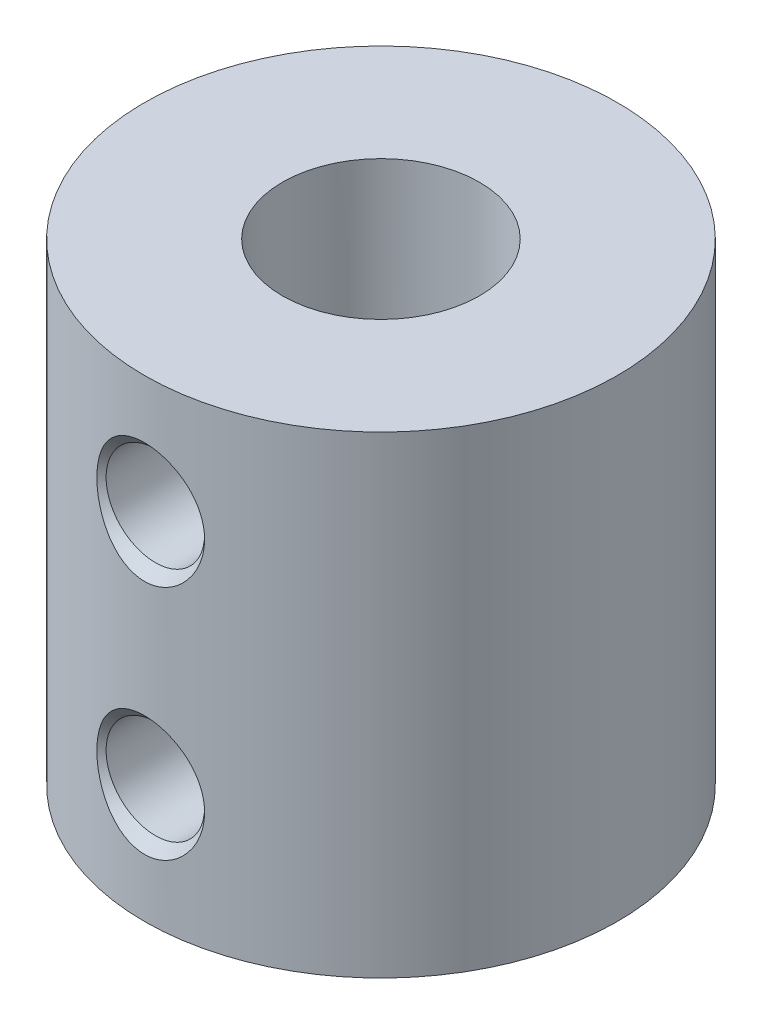
ISO-10303-21;
HEADER;
FILE_DESCRIPTION(('STEP AP214'),'2;1');
FILE_NAME('part.step','',(''),(''),'','','');
FILE_SCHEMA(('AUTOMOTIVE_DESIGN { 1 0 10303 214 1 1 1 1 }'));
ENDSEC;
DATA;
#1=APPLICATION_CONTEXT('core data for automotive mechanical design processes');
#2=APPLICATION_PROTOCOL_DEFINITION('international standard','automotive_design',2000,#1);
#3=PRODUCT_CONTEXT('',#1,'mechanical');
#4=PRODUCT('Part','Part','',(#3));
#5=PRODUCT_RELATED_PRODUCT_CATEGORY('part','',(#4));
#6=PRODUCT_DEFINITION_FORMATION('','',#4);
#7=PRODUCT_DEFINITION_CONTEXT('part definition',#1,'design');
#8=PRODUCT_DEFINITION('design','',#6,#7);
#9=PRODUCT_DEFINITION_SHAPE('','',#8);
#10=(LENGTH_UNIT() NAMED_UNIT(*) SI_UNIT(.MILLI.,.METRE.));
#11=(NAMED_UNIT(*) PLANE_ANGLE_UNIT() SI_UNIT($,.RADIAN.));
#12=(NAMED_UNIT(*) SI_UNIT($,.STERADIAN.) SOLID_ANGLE_UNIT());
#13=UNCERTAINTY_MEASURE_WITH_UNIT(LENGTH_MEASURE(1.E-05),#10,'distance_accuracy_value','');
#14=(GEOMETRIC_REPRESENTATION_CONTEXT(3) GLOBAL_UNCERTAINTY_ASSIGNED_CONTEXT((#13)) GLOBAL_UNIT_ASSIGNED_CONTEXT((#10,
#11,#12)) REPRESENTATION_CONTEXT('',''));
#15=CARTESIAN_POINT('',(0.,0.,0.));
#16=DIRECTION('',(0.,0.,1.));
#17=DIRECTION('',(1.,0.,0.));
#18=AXIS2_PLACEMENT_3D('',#15,#16,#17);
#19=CARTESIAN_POINT('',(-1.45322348865449,13.6450243442956,2.4942884406893));
#20=DIRECTION('',(0.00394361579578582,0.,-0.999992223916994));
#21=DIRECTION('',(-0.999992223916994,0.,-0.00394361579578582));
#22=AXIS2_PLACEMENT_3D('',#19,#20,#21);
#23=PLANE('',#22);
#24=CARTESIAN_POINT('',(-0.00601415438862823,3.,2.49999572266002));
#25=DIRECTION('',(0.00394361579578582,0.,-0.999992223916994));
#26=DIRECTION('',(-0.999992223916994,0.,-0.00394361579578582));
#27=AXIS2_PLACEMENT_3D('',#24,#25,#26);
#28=ELLIPSE('',#27,1.52503557650191,1.52501185880323);
#29=CARTESIAN_POINT('',(1.43350540967556,2.49653518295812,2.50567267889569));
#30=VERTEX_POINT('',#29);
#31=CARTESIAN_POINT('',(0.,1.475,2.50001944035869));
#32=VERTEX_POINT('',#31);
#33=EDGE_CURVE('E56',#30,#32,#28,.T.);
#34=ORIENTED_EDGE('',*,*,#33,.F.);
#35=DIRECTION('',(0.,-1.,0.));
#36=VECTOR('',#35,1.);
#37=CARTESIAN_POINT('',(1.43350540967556,13.6450243442956,2.50567267889569));
#38=LINE('',#37,#36);
#39=CARTESIAN_POINT('',(1.43350540967556,0.,2.50567267889569));
#40=VERTEX_POINT('',#39);
#41=EDGE_CURVE('E237',#30,#40,#38,.T.);
#42=ORIENTED_EDGE('',*,*,#41,.T.);
#43=DIRECTION('',(0.999992223916994,0.,0.00394361579578582));
#44=VECTOR('',#43,1.);
#45=CARTESIAN_POINT('',(-1.45322348865449,0.,2.4942884406893));
#46=LINE('',#45,#44);
#47=CARTESIAN_POINT('',(-1.45322348865449,0.,2.4942884406893));
#48=VERTEX_POINT('',#47);
#49=EDGE_CURVE('E265',#48,#40,#46,.T.);
#50=ORIENTED_EDGE('',*,*,#49,.F.);
#51=DIRECTION('',(0.,-1.,0.));
#52=VECTOR('',#51,1.);
#53=CARTESIAN_POINT('',(-1.45322348865449,13.6450243442956,2.4942884406893));
#54=LINE('',#53,#52);
#55=CARTESIAN_POINT('',(-1.45322348865449,2.53765111439211,2.4942884406893));
#56=VERTEX_POINT('',#55);
#57=EDGE_CURVE('E253',#56,#48,#54,.T.);
#58=ORIENTED_EDGE('',*,*,#57,.F.);
#59=CARTESIAN_POINT('',(0.,3.,2.50001944035869));
#60=DIRECTION('',(0.00394361579578582,0.,-0.999992223916994));
#61=DIRECTION('',(0.999992223916994,0.,0.00394361579578582));
#62=AXIS2_PLACEMENT_3D('',#59,#60,#61);
#63=ELLIPSE('',#62,1.5250118586188,1.525);
#64=EDGE_CURVE('E211',#32,#56,#63,.T.);
#65=ORIENTED_EDGE('',*,*,#64,.F.);
#66=EDGE_LOOP('',(#34,#42,#50,#58,#65));
#67=FACE_BOUND('',#66,.T.);
#68=ADVANCED_FACE('F31',(#67),#23,.T.);
#69=CARTESIAN_POINT('',(0.,0.,0.));
#70=DIRECTION('',(0.,1.,0.));
#71=DIRECTION('',(0.,0.,1.));
#72=AXIS2_PLACEMENT_3D('',#69,#70,#71);
#73=PLANE('',#72);
#74=CARTESIAN_POINT('',(0.,0.,0.));
#75=DIRECTION('',(0.,1.,0.));
#76=DIRECTION('',(0.,0.,1.));
#77=AXIS2_PLACEMENT_3D('',#74,#75,#76);
#78=CIRCLE('',#77,6.);
#79=CARTESIAN_POINT('',(0.,0.,6.));
#80=VERTEX_POINT('',#79);
#81=EDGE_CURVE('E221',#80,#80,#78,.T.);
#82=ORIENTED_EDGE('',*,*,#81,.F.);
#83=EDGE_LOOP('',(#82));
#84=FACE_BOUND('',#83,.T.);
#85=DIRECTION('',(0.496580840496581,0.,0.867990477396906));
#86=VECTOR('',#85,1.);
#87=CARTESIAN_POINT('',(-2.88672889833005,0.,-0.0113842382063857));
#88=LINE('',#87,#86);
#89=CARTESIAN_POINT('',(-2.88672889833005,0.,-0.0113842382063857));
#90=VERTEX_POINT('',#89);
#91=EDGE_CURVE('E254',#90,#48,#88,.T.);
#92=ORIENTED_EDGE('',*,*,#91,.T.);
#93=ORIENTED_EDGE('',*,*,#49,.T.);
#94=DIRECTION('',(0.503411383420413,0.,-0.864046861601121));
#95=VECTOR('',#94,1.);
#96=CARTESIAN_POINT('',(1.43350540967556,0.,2.50567267889569));
#97=LINE('',#96,#95);
#98=CARTESIAN_POINT('',(2.88672889833005,0.,0.0113842382063875));
#99=VERTEX_POINT('',#98);
#100=EDGE_CURVE('E263',#40,#99,#97,.T.);
#101=ORIENTED_EDGE('',*,*,#100,.T.);
#102=DIRECTION('',(-0.496580840496581,0.,-0.867990477396906));
#103=VECTOR('',#102,1.);
#104=CARTESIAN_POINT('',(2.88672889833005,0.,0.0113842382063875));
#105=LINE('',#104,#103);
#106=CARTESIAN_POINT('',(1.45322348865449,0.,-2.4942884406893));
#107=VERTEX_POINT('',#106);
#108=EDGE_CURVE('E261',#99,#107,#105,.T.);
#109=ORIENTED_EDGE('',*,*,#108,.T.);
#110=DIRECTION('',(-0.999992223916994,0.,-0.00394361579578567));
#111=VECTOR('',#110,1.);
#112=CARTESIAN_POINT('',(1.45322348865449,0.,-2.4942884406893));
#113=LINE('',#112,#111);
#114=CARTESIAN_POINT('',(-1.43350540967556,0.,-2.50567267889569));
#115=VERTEX_POINT('',#114);
#116=EDGE_CURVE('E259',#107,#115,#113,.T.);
#117=ORIENTED_EDGE('',*,*,#116,.T.);
#118=DIRECTION('',(-0.503411383420413,0.,0.864046861601121));
#119=VECTOR('',#118,1.);
#120=CARTESIAN_POINT('',(-1.43350540967556,0.,-2.50567267889569));
#121=LINE('',#120,#119);
#122=EDGE_CURVE('E257',#115,#90,#121,.T.);
#123=ORIENTED_EDGE('',*,*,#122,.T.);
#124=EDGE_LOOP('',(#92,#93,#101,#109,#117,#123));
#125=FACE_BOUND('',#124,.T.);
#126=ADVANCED_FACE('F159',(#84,#125),#73,.F.);
#127=CARTESIAN_POINT('',(0.,12.,0.));
#128=DIRECTION('',(0.,-1.,0.));
#129=DIRECTION('',(0.,0.,-1.));
#130=AXIS2_PLACEMENT_3D('',#127,#128,#129);
#131=CYLINDRICAL_SURFACE('',#130,2.5);
#132=CARTESIAN_POINT('',(1.525,9.,1.98100353356575));
#133=CARTESIAN_POINT('',(1.52499492171974,8.92374722139207,1.98101129789833));
#134=CARTESIAN_POINT('',(1.51922907839568,8.84735606596177,1.98548718326427));
#135=CARTESIAN_POINT('',(1.49655848145347,8.69709416937525,2.00262330984394));
#136=CARTESIAN_POINT('',(1.47962031728919,8.62323168924482,2.01530809742034));
#137=CARTESIAN_POINT('',(1.43576786079199,8.4806588850031,2.04677412274575));
#138=CARTESIAN_POINT('',(1.40893650458591,8.41191128243371,2.06550452101057));
#139=CARTESIAN_POINT('',(1.34630316554546,8.27997772868786,2.10686343501451));
#140=CARTESIAN_POINT('',(1.31050175711183,8.21679142174165,2.1294917011232));
#141=CARTESIAN_POINT('',(1.22563990373981,8.0889331097008,2.17957074598538));
#142=CARTESIAN_POINT('',(1.17547282184875,8.02509218338219,2.20726897245733));
#143=CARTESIAN_POINT('',(1.0655658868299,7.90603239419761,2.2623781635907));
#144=CARTESIAN_POINT('',(1.00581801705445,7.85082082895542,2.28978886702423));
#145=CARTESIAN_POINT('',(0.870272534013958,7.7444198082331,2.34490030781887));
#146=CARTESIAN_POINT('',(0.793424484679834,7.6943881393866,2.37228442298518));
#147=CARTESIAN_POINT('',(0.63041341873413,7.60835665055166,2.4206985385051));
#148=CARTESIAN_POINT('',(0.544259351699337,7.57234349979293,2.44173457120396));
#149=CARTESIAN_POINT('',(0.373989830773632,7.51915122360809,2.47323212045012));
#150=CARTESIAN_POINT('',(0.29050096036796,7.50047307209759,2.48452745034391));
#151=CARTESIAN_POINT('',(0.120891942139537,7.47739921438317,2.49851940159797));
#152=CARTESIAN_POINT('',(0.03477446719025,7.47298945777558,2.501224481918));
#153=CARTESIAN_POINT('',(-0.125743840141964,7.47834833402955,2.49795938630501));
#154=CARTESIAN_POINT('',(-0.200233078496372,7.48637390817483,2.49305561328968));
#155=CARTESIAN_POINT('',(-0.346571351754475,7.51304199617311,2.47695494154555));
#156=CARTESIAN_POINT('',(-0.418420186896576,7.53168531156582,2.46575756770986));
#157=CARTESIAN_POINT('',(-0.558032645396032,7.57884414329162,2.43796958987444));
#158=CARTESIAN_POINT('',(-0.625776094438257,7.60740439510174,2.4213545678248));
#159=CARTESIAN_POINT('',(-0.755580439312915,7.67333943281927,2.38404386833898));
#160=CARTESIAN_POINT('',(-0.817639928925312,7.71071639185926,2.36334718506582));
#161=CARTESIAN_POINT('',(-0.942401898319157,7.79833410143713,2.31664325426361));
#162=CARTESIAN_POINT('',(-1.00426612603097,7.84958609686116,2.2902962981657));
#163=CARTESIAN_POINT('',(-1.11905100774202,7.96088784147643,2.23646019911834));
#164=CARTESIAN_POINT('',(-1.17195894296089,8.02094987970214,2.20896949978178));
#165=CARTESIAN_POINT('',(-1.27385380489807,8.15679988897633,2.15199865351112));
#166=CARTESIAN_POINT('',(-1.32157939831417,8.23361216885946,2.12268370171008));
#167=CARTESIAN_POINT('',(-1.40321363223876,8.39598531252457,2.06963104069322));
#168=CARTESIAN_POINT('',(-1.43714783370176,8.48152962062531,2.04588304858662));
#169=CARTESIAN_POINT('',(-1.48271437882387,8.63673507367936,2.01299230746254));
#170=CARTESIAN_POINT('',(-1.49782183190419,8.70491299981811,2.0016720844378));
#171=CARTESIAN_POINT('',(-1.51855394609946,8.84344865115027,1.98599354182264));
#172=CARTESIAN_POINT('',(-1.52419038273947,8.91380355859098,1.98162657744618));
#173=CARTESIAN_POINT('',(-1.52564799438549,9.0547975496988,1.9805049039136));
#174=CARTESIAN_POINT('',(-1.52145226801517,9.12543691402157,1.98376330265693));
#175=CARTESIAN_POINT('',(-1.5034804604902,9.26479634992738,1.99741516325187));
#176=CARTESIAN_POINT('',(-1.4896966368959,9.33351482370082,2.00781439127396));
#177=CARTESIAN_POINT('',(-1.45340740666528,9.46688428552705,2.03423196145524));
#178=CARTESIAN_POINT('',(-1.43096348486023,9.53156029453818,2.05021061652279));
#179=CARTESIAN_POINT('',(-1.37816622519893,9.65641709437996,2.08606672890409));
#180=CARTESIAN_POINT('',(-1.34780998317732,9.71659622420323,2.10594561710906));
#181=CARTESIAN_POINT('',(-1.27359440731444,9.84253552608357,2.15178755744497));
#182=CARTESIAN_POINT('',(-1.22827681179747,9.90727489525008,2.17819630532248));
#183=CARTESIAN_POINT('',(-1.12834104438345,10.0289204185559,2.23160553827569));
#184=CARTESIAN_POINT('',(-1.07371362916918,10.085818685065,2.25860658798106));
#185=CARTESIAN_POINT('',(-0.947494256102589,10.1983315727948,2.31466361812934));
#186=CARTESIAN_POINT('',(-0.874595272646756,10.2526217561897,2.34346860181092));
#187=CARTESIAN_POINT('',(-0.718901983115557,10.3480063439564,2.39581051166219));
#188=CARTESIAN_POINT('',(-0.636113611752499,10.3891086084673,2.41935057323699));
#189=CARTESIAN_POINT('',(-0.468672987092277,10.4537750340264,2.45707063477177));
#190=CARTESIAN_POINT('',(-0.384532519388757,10.4783437545921,2.47177931356308));
#191=CARTESIAN_POINT('',(-0.212279035718037,10.5126955340819,2.49247451209789));
#192=CARTESIAN_POINT('',(-0.124171039271207,10.5224967633025,2.49847175029215));
#193=CARTESIAN_POINT('',(0.0401910320853542,10.5263709017881,2.50083738946254));
#194=CARTESIAN_POINT('',(0.116388777882105,10.5224424143792,2.49842938930696));
#195=CARTESIAN_POINT('',(0.266836533639424,10.5033861268299,2.48686281486913));
#196=CARTESIAN_POINT('',(0.341086560344629,10.4882584230024,2.47770429864111));
#197=CARTESIAN_POINT('',(0.483936965853625,10.4480383696321,2.45375984543673));
#198=CARTESIAN_POINT('',(0.552628256592004,10.4231843988741,2.43910885884555));
#199=CARTESIAN_POINT('',(0.684849461574841,10.3644936490671,2.40533630023946));
#200=CARTESIAN_POINT('',(0.748378359727262,10.3306551071888,2.38621385098351));
#201=CARTESIAN_POINT('',(0.875820971152278,10.250921023234,2.34263624333162));
#202=CARTESIAN_POINT('',(0.939047795302068,10.2041225365883,2.31782935025686));
#203=CARTESIAN_POINT('',(1.05723366080752,10.1018176983202,2.2663674570174));
#204=CARTESIAN_POINT('',(1.11218298662153,10.0463012678383,2.23971033795266));
#205=CARTESIAN_POINT('',(1.21984942582394,9.91946461961594,2.18314865852935));
#206=CARTESIAN_POINT('',(1.27127714427543,9.8470233531553,2.15328842601601));
#207=CARTESIAN_POINT('',(1.36129177654849,9.69313277745862,2.09754453551839));
#208=CARTESIAN_POINT('',(1.39988816924632,9.61169017730123,2.07165794972857));
#209=CARTESIAN_POINT('',(1.45555819839569,9.46037936940661,2.03279034740367));
#210=CARTESIAN_POINT('',(1.47551186037458,9.39197904562177,2.01821876267025));
#211=CARTESIAN_POINT('',(1.50570389400192,9.25211165437958,1.99580073738226));
#212=CARTESIAN_POINT('',(1.51597432734032,9.18065553231768,1.9879321113816));
#213=CARTESIAN_POINT('',(1.52241220729945,9.09064890592793,1.9829929818964));
#214=CARTESIAN_POINT('',(1.52338141760783,9.07254424412859,1.98224872168731));
#215=CARTESIAN_POINT('',(1.52467597564328,9.03629567293081,1.98125302956268));
#216=CARTESIAN_POINT('',(1.52500120887018,9.01815175712696,1.98100168528846));
#217=CARTESIAN_POINT('',(1.525,9.,1.98100353356575));
#218=B_SPLINE_CURVE_WITH_KNOTS('',3,(#132,#133,#134,#135,#136,#137,#138,#139,#140,#141,#142,
#143,#144,#145,#146,#147,#148,#149,#150,#151,#152,#153,#154,#155,#156,#157,#158,#159,#160,#161,
#162,#163,#164,#165,#166,#167,#168,#169,#170,#171,#172,#173,#174,#175,#176,#177,#178,#179,#180,
#181,#182,#183,#184,#185,#186,#187,#188,#189,#190,#191,#192,#193,#194,#195,#196,#197,#198,#199,
#200,#201,#202,#203,#204,#205,#206,#207,#208,#209,#210,#211,#212,#213,#214,#215,#216,#217),
.UNSPECIFIED.,.T.,.F.,(4,2,2,2,2,2,2,2,2,2,2,2,2,2,2,2,2,2,2,2,2,2,2,2,2,2,2,2,2,2,2,2,2,2,2,2,
2,2,2,2,2,2,4),(0.,0.228674727302821,0.45803642006556,0.685517504561196,0.912984025939703,
1.16934864128595,1.4259288978906,1.71147615038918,1.99675119731817,2.25408958921758,
2.511174497074,2.7353431922148,2.95952881222954,3.18473916578186,3.41000508705098,
3.66264452589884,3.91563978041089,4.19943258312745,4.48269697914798,4.69402695598139,
4.90509398661276,5.11652410514946,5.32812515313112,5.53825073013599,5.74845354123268,
5.99746395344112,6.2467230531981,6.53130347395548,6.81571396534028,7.08073630439865,
7.34543228617464,7.57330017737474,7.80116610894088,8.0237657054468,8.24640900970454,
8.49288731243608,8.73965269682945,9.01953711215542,9.29921430683183,9.51653575674796,
9.7331350902332,9.7875607827372,9.84199615134741),.UNSPECIFIED.);
#219=CARTESIAN_POINT('',(0.,7.475,2.5));
#220=VERTEX_POINT('',#219);
#221=CARTESIAN_POINT('',(0.,10.525,2.5));
#222=VERTEX_POINT('',#221);
#223=EDGE_CURVE('E42',#220,#222,#218,.T.);
#224=ORIENTED_EDGE('',*,*,#223,.F.);
#225=EDGE_CURVE('E132',#222,#220,#218,.T.);
#226=ORIENTED_EDGE('',*,*,#225,.F.);
#227=EDGE_LOOP('',(#224,#226));
#228=FACE_BOUND('',#227,.T.);
#229=CARTESIAN_POINT('',(0.,12.,0.));
#230=DIRECTION('',(0.,1.,0.));
#231=DIRECTION('',(0.,0.,1.));
#232=AXIS2_PLACEMENT_3D('',#229,#230,#231);
#233=CIRCLE('',#232,2.5);
#234=CARTESIAN_POINT('',(0.,12.,2.5));
#235=VERTEX_POINT('',#234);
#236=EDGE_CURVE('E224',#235,#235,#233,.T.);
#237=ORIENTED_EDGE('',*,*,#236,.T.);
#238=EDGE_LOOP('',(#237));
#239=FACE_BOUND('',#238,.T.);
#240=CARTESIAN_POINT('',(0.,6.,0.));
#241=DIRECTION('',(0.,-1.,0.));
#242=DIRECTION('',(0.,0.,-1.));
#243=AXIS2_PLACEMENT_3D('',#240,#241,#242);
#244=CIRCLE('',#243,2.5);
#245=CARTESIAN_POINT('',(-2.16011715400281,6.,-1.25852845855104));
#246=VERTEX_POINT('',#245);
#247=CARTESIAN_POINT('',(0.00985903948946421,6.,-2.49998055979249));
#248=VERTEX_POINT('',#247);
#249=EDGE_CURVE('E216',#246,#248,#244,.T.);
#250=ORIENTED_EDGE('',*,*,#249,.T.);
#251=CARTESIAN_POINT('',(2.16997619349227,6.,-1.24145210124146));
#252=VERTEX_POINT('',#251);
#253=EDGE_CURVE('E214',#248,#252,#244,.T.);
#254=ORIENTED_EDGE('',*,*,#253,.T.);
#255=CARTESIAN_POINT('',(2.16011715400281,6.,1.25852845855104));
#256=VERTEX_POINT('',#255);
#257=EDGE_CURVE('E369',#252,#256,#244,.T.);
#258=ORIENTED_EDGE('',*,*,#257,.T.);
#259=CARTESIAN_POINT('',(-0.00985903948946457,6.,2.49998055979249));
#260=VERTEX_POINT('',#259);
#261=EDGE_CURVE('E371',#256,#260,#244,.T.);
#262=ORIENTED_EDGE('',*,*,#261,.T.);
#263=CARTESIAN_POINT('',(-2.16997619349227,6.,1.24145210124146));
#264=VERTEX_POINT('',#263);
#265=EDGE_CURVE('E372',#260,#264,#244,.T.);
#266=ORIENTED_EDGE('',*,*,#265,.T.);
#267=EDGE_CURVE('E219',#264,#246,#244,.T.);
#268=ORIENTED_EDGE('',*,*,#267,.T.);
#269=EDGE_LOOP('',(#250,#254,#258,#262,#266,#268));
#270=FACE_BOUND('',#269,.T.);
#271=ADVANCED_FACE('F142',(#228,#239,#270),#131,.F.);
#272=CARTESIAN_POINT('',(0.,12.,0.));
#273=DIRECTION('',(0.,1.,0.));
#274=DIRECTION('',(0.,0.,1.));
#275=AXIS2_PLACEMENT_3D('',#272,#273,#274);
#276=PLANE('',#275);
#277=CARTESIAN_POINT('',(0.,12.,0.));
#278=DIRECTION('',(0.,1.,0.));
#279=DIRECTION('',(0.,0.,1.));
#280=AXIS2_PLACEMENT_3D('',#277,#278,#279);
#281=CIRCLE('',#280,6.);
#282=CARTESIAN_POINT('',(0.,12.,6.));
#283=VERTEX_POINT('',#282);
#284=EDGE_CURVE('E220',#283,#283,#281,.T.);
#285=ORIENTED_EDGE('',*,*,#284,.T.);
#286=EDGE_LOOP('',(#285));
#287=FACE_BOUND('',#286,.T.);
#288=ORIENTED_EDGE('',*,*,#236,.F.);
#289=EDGE_LOOP('',(#288));
#290=FACE_BOUND('',#289,.T.);
#291=ADVANCED_FACE('F158',(#287,#290),#276,.T.);
#292=CARTESIAN_POINT('',(0.,12.,0.));
#293=DIRECTION('',(0.,-1.,0.));
#294=DIRECTION('',(0.,0.,-1.));
#295=AXIS2_PLACEMENT_3D('',#292,#293,#294);
#296=CYLINDRICAL_SURFACE('',#295,6.);
#297=CARTESIAN_POINT('',(-1.00732038769462,7.97119565281463,5.91483775658699));
#298=CARTESIAN_POINT('',(-1.0625572167337,8.03844908000393,5.90543128244687));
#299=CARTESIAN_POINT('',(-1.1119450928033,8.11062669730159,5.89622727626031));
#300=CARTESIAN_POINT('',(-1.19816011091402,8.26237990598063,5.87931576917396));
#301=CARTESIAN_POINT('',(-1.23496409543614,8.34196879728746,5.87161103842038));
#302=CARTESIAN_POINT('',(-1.29550008714942,8.50648277213711,5.85855311445987));
#303=CARTESIAN_POINT('',(-1.31918435597302,8.591426106717,5.8532085231466));
#304=CARTESIAN_POINT('',(-1.35290234778387,8.76406516825956,5.84550733148309));
#305=CARTESIAN_POINT('',(-1.36294121055757,8.8517598461385,5.8431496060991));
#306=CARTESIAN_POINT('',(-1.3693652007367,9.03146998880358,5.84164829843658));
#307=CARTESIAN_POINT('',(-1.36514396828115,9.12350894726367,5.84264744553621));
#308=CARTESIAN_POINT('',(-1.34176422645992,9.30559136720378,5.84806031937853));
#309=CARTESIAN_POINT('',(-1.32260179220375,9.39563429795639,5.85247494332733));
#310=CARTESIAN_POINT('',(-1.26955658372633,9.57145553867203,5.86421037888129));
#311=CARTESIAN_POINT('',(-1.23561954165774,9.65721681488935,5.87154189574134));
#312=CARTESIAN_POINT('',(-1.15355452356077,9.82148962855673,5.88821351349967));
#313=CARTESIAN_POINT('',(-1.10542559254557,9.90000067766452,5.89755374955527));
#314=CARTESIAN_POINT('',(-0.997431067079704,10.0448106928749,5.91675947634123));
#315=CARTESIAN_POINT('',(-0.937956064421903,10.1114028757775,5.92660116071936));
#316=CARTESIAN_POINT('',(-0.807572778572499,10.2323901106385,5.9457671407107));
#317=CARTESIAN_POINT('',(-0.736672119814302,10.286793238982,5.9550917758162));
#318=CARTESIAN_POINT('',(-0.592229184508391,10.3762518231714,5.97110086326186));
#319=CARTESIAN_POINT('',(-0.519522334296951,10.4126221867845,5.97794883133935));
#320=CARTESIAN_POINT('',(-0.368354061775824,10.4708855125874,5.98915923947937));
#321=CARTESIAN_POINT('',(-0.289899115696944,10.4927944976266,5.99352442965381));
#322=CARTESIAN_POINT('',(-0.13979016106698,10.5190323166964,5.99878383296519));
#323=CARTESIAN_POINT('',(-0.0684608162744464,10.5251664888293,6.00003390907518));
#324=CARTESIAN_POINT('',(0.0741565668801915,10.5248268419741,5.99996473941875));
#325=CARTESIAN_POINT('',(0.145444611044835,10.5183573019057,5.99864636563278));
#326=CARTESIAN_POINT('',(0.281699711330631,10.4939071631755,5.99374965828111));
#327=CARTESIAN_POINT('',(0.346795376060321,10.4766042077672,5.99030452290538));
#328=CARTESIAN_POINT('',(0.473295716776515,10.4319346045143,5.98163978874799));
#329=CARTESIAN_POINT('',(0.534699911497291,10.4045666477676,5.97641995918308));
#330=CARTESIAN_POINT('',(0.655148937892169,10.3394349372709,5.96444546834219));
#331=CARTESIAN_POINT('',(0.713964814463624,10.3012603652792,5.95763252098112));
#332=CARTESIAN_POINT('',(0.82507501536845,10.216506750001,5.94326477324329));
#333=CARTESIAN_POINT('',(0.8773667917489,10.1699244403857,5.93570968507338));
#334=CARTESIAN_POINT('',(0.979878874616082,10.0643720246854,5.91969696852427));
#335=CARTESIAN_POINT('',(1.02928222856886,10.0046103660667,5.91122908464167));
#336=CARTESIAN_POINT('',(1.11849706997978,9.87823014899506,5.89499995296438));
#337=CARTESIAN_POINT('',(1.15830421538346,9.81160850594788,5.88723902603517));
#338=CARTESIAN_POINT('',(1.23150221770142,9.66585454340792,5.87238854278172));
#339=CARTESIAN_POINT('',(1.26377583596079,9.58614357888775,5.86545576964514));
#340=CARTESIAN_POINT('',(1.31553900889379,9.42250533559973,5.85406362893617));
#341=CARTESIAN_POINT('',(1.33502492532302,9.33857686420947,5.84960496533133));
#342=CARTESIAN_POINT('',(1.36167438773833,9.1636712904829,5.84346196331302));
#343=CARTESIAN_POINT('',(1.36805648423666,9.07256792484541,5.84195380587374));
#344=CARTESIAN_POINT('',(1.36606722652635,8.89052541720313,5.84241898623785));
#345=CARTESIAN_POINT('',(1.35769381176682,8.79958629991025,5.84439281028674));
#346=CARTESIAN_POINT('',(1.3261106711044,8.61912748245144,5.8516404284706));
#347=CARTESIAN_POINT('',(1.30269440448541,8.52964560690141,5.85696014054536));
#348=CARTESIAN_POINT('',(1.24121316011803,8.35604499571632,5.87029590269997));
#349=CARTESIAN_POINT('',(1.20314612768998,8.27192701426407,5.87831233095778));
#350=CARTESIAN_POINT('',(1.1136494956924,8.11291762780887,5.895916249366));
#351=CARTESIAN_POINT('',(1.06242403970803,8.03790900811002,5.90547897651683));
#352=CARTESIAN_POINT('',(0.94722814343741,7.89842517093241,5.92504502332219));
#353=CARTESIAN_POINT('',(0.883261528037212,7.83394680282687,5.93504821005079));
#354=CARTESIAN_POINT('',(0.748703574776038,7.72237185830967,5.95346362496181));
#355=CARTESIAN_POINT('',(0.678855355228888,7.67439323956131,5.96193773582487));
#356=CARTESIAN_POINT('',(0.531105524715199,7.5926261830056,5.9769062092819));
#357=CARTESIAN_POINT('',(0.453213174667967,7.55882164912783,5.98340281521654));
#358=CARTESIAN_POINT('',(0.301742486861647,7.51061122445053,5.99282925286203));
#359=CARTESIAN_POINT('',(0.228770506103551,7.49436240978149,5.99609387934914));
#360=CARTESIAN_POINT('',(0.0810310347313773,7.47543284426644,5.99990641356615));
#361=CARTESIAN_POINT('',(0.00626477786796735,7.47274302440823,6.00045613716958));
#362=CARTESIAN_POINT('',(-0.135775253712959,7.48069860234123,5.99884670170859));
#363=CARTESIAN_POINT('',(-0.203121027444959,7.49017273925062,5.99692544307746));
#364=CARTESIAN_POINT('',(-0.335264748290144,7.51999831924415,5.99099100463259));
#365=CARTESIAN_POINT('',(-0.400062186390656,7.54035192369985,5.98697740914826));
#366=CARTESIAN_POINT('',(-0.526115404644997,7.59126421541546,5.97722735475829));
#367=CARTESIAN_POINT('',(-0.587328336188919,7.62192484104546,5.97147374623539));
#368=CARTESIAN_POINT('',(-0.704205646800114,7.69216775988878,5.95882130341706));
#369=CARTESIAN_POINT('',(-0.759873062239021,7.73174513170679,5.95192310140536));
#370=CARTESIAN_POINT('',(-0.847902845940636,7.80455406337528,5.93989518893234));
#371=CARTESIAN_POINT('',(-0.88200657651437,7.83573912583488,5.93490934552203));
#372=CARTESIAN_POINT('',(-0.94706242091887,7.90121935686673,5.92487592256493));
#373=CARTESIAN_POINT('',(-0.978014589884656,7.93551447101031,5.91982834409989));
#374=CARTESIAN_POINT('',(-1.00732038769462,7.97119565281463,5.91483775658699));
#375=B_SPLINE_CURVE_WITH_KNOTS('',3,(#297,#298,#299,#300,#301,#302,#303,#304,#305,#306,#307,
#308,#309,#310,#311,#312,#313,#314,#315,#316,#317,#318,#319,#320,#321,#322,#323,#324,#325,#326,
#327,#328,#329,#330,#331,#332,#333,#334,#335,#336,#337,#338,#339,#340,#341,#342,#343,#344,#345,
#346,#347,#348,#349,#350,#351,#352,#353,#354,#355,#356,#357,#358,#359,#360,#361,#362,#363,#364,
#365,#366,#367,#368,#369,#370,#371,#372,#373,#374),.UNSPECIFIED.,.T.,.F.,(4,2,2,2,2,2,2,2,2,2,2,
2,2,2,2,2,2,2,2,2,2,2,2,2,2,2,2,2,2,2,2,2,2,2,2,2,2,2,4),(0.,0.262436347529811,
0.525353076759216,0.789220293463882,1.05298809229006,1.32811039544878,1.6033049945899,
1.87951903929043,2.1557516749615,2.42378855151125,2.69164729993872,2.93499491007315,
3.17807244246412,3.39175918356619,3.60537339135055,3.80680298500644,4.00825878282087,
4.21874018382816,4.42930353161712,4.66234338592003,4.89548848808494,5.15318720780322,
5.41095921394385,5.6837032303038,5.95648533734414,6.23309524058099,6.50974395079712,
6.78233570784822,7.05484575606622,7.30888108663872,7.56262714858272,7.7858815721096,
8.00898665079045,8.21213588750413,8.41532549790893,8.62058689753883,8.82573528413765,
8.96497284079323,9.10420796113756),.UNSPECIFIED.);
#376=CARTESIAN_POINT('',(-1.00732038769462,7.97119565281463,5.91483775658699));
#377=VERTEX_POINT('',#376);
#378=EDGE_CURVE('E11',#377,#377,#375,.T.);
#379=ORIENTED_EDGE('',*,*,#378,.T.);
#380=EDGE_LOOP('',(#379));
#381=FACE_BOUND('',#380,.T.);
#382=CARTESIAN_POINT('',(-1.00732038769462,1.97119565281462,5.91483775658699));
#383=CARTESIAN_POINT('',(-1.06255721673369,2.03844908000393,5.90543128244687));
#384=CARTESIAN_POINT('',(-1.1119450928033,2.11062669730158,5.89622727626031));
#385=CARTESIAN_POINT('',(-1.19816011091402,2.26237990598063,5.87931576917396));
#386=CARTESIAN_POINT('',(-1.23496409543614,2.34196879728746,5.87161103842038));
#387=CARTESIAN_POINT('',(-1.29550008714942,2.50648277213711,5.85855311445987));
#388=CARTESIAN_POINT('',(-1.31918435597302,2.591426106717,5.8532085231466));
#389=CARTESIAN_POINT('',(-1.35290234778387,2.76406516825956,5.84550733148309));
#390=CARTESIAN_POINT('',(-1.36294121055757,2.85175984613849,5.8431496060991));
#391=CARTESIAN_POINT('',(-1.3693652007367,3.03146998880358,5.84164829843658));
#392=CARTESIAN_POINT('',(-1.36514396828115,3.12350894726367,5.84264744553621));
#393=CARTESIAN_POINT('',(-1.34176422645992,3.30559136720378,5.84806031937853));
#394=CARTESIAN_POINT('',(-1.32260179220375,3.39563429795639,5.85247494332733));
#395=CARTESIAN_POINT('',(-1.26955658372633,3.57145553867203,5.86421037888129));
#396=CARTESIAN_POINT('',(-1.23561954165774,3.65721681488935,5.87154189574134));
#397=CARTESIAN_POINT('',(-1.15355452356077,3.82148962855673,5.88821351349967));
#398=CARTESIAN_POINT('',(-1.10542559254557,3.90000067766452,5.89755374955527));
#399=CARTESIAN_POINT('',(-0.997431067079705,4.04481069287493,5.91675947634123));
#400=CARTESIAN_POINT('',(-0.937956064421904,4.11140287577748,5.92660116071936));
#401=CARTESIAN_POINT('',(-0.8075727785725,4.23239011063855,5.9457671407107));
#402=CARTESIAN_POINT('',(-0.736672119814304,4.286793238982,5.9550917758162));
#403=CARTESIAN_POINT('',(-0.592229184508393,4.37625182317138,5.97110086326186));
#404=CARTESIAN_POINT('',(-0.519522334296952,4.41262218678446,5.97794883133935));
#405=CARTESIAN_POINT('',(-0.368354061775825,4.47088551258738,5.98915923947937));
#406=CARTESIAN_POINT('',(-0.289899115696945,4.49279449762663,5.99352442965381));
#407=CARTESIAN_POINT('',(-0.139790161066981,4.51903231669636,5.99878383296519));
#408=CARTESIAN_POINT('',(-0.0684608162744478,4.52516648882927,6.00003390907518));
#409=CARTESIAN_POINT('',(0.07415656688019,4.52482684197411,5.99996473941875));
#410=CARTESIAN_POINT('',(0.145444611044833,4.5183573019057,5.99864636563278));
#411=CARTESIAN_POINT('',(0.28169971133063,4.49390716317546,5.99374965828111));
#412=CARTESIAN_POINT('',(0.34679537606032,4.4766042077672,5.99030452290538));
#413=CARTESIAN_POINT('',(0.473295716776515,4.4319346045143,5.98163978874799));
#414=CARTESIAN_POINT('',(0.53469991149729,4.40456664776762,5.97641995918308));
#415=CARTESIAN_POINT('',(0.655148937892168,4.33943493727088,5.96444546834219));
#416=CARTESIAN_POINT('',(0.713964814463623,4.3012603652792,5.95763252098112));
#417=CARTESIAN_POINT('',(0.825075015368449,4.21650675000096,5.94326477324329));
#418=CARTESIAN_POINT('',(0.877366791748898,4.16992444038573,5.93570968507338));
#419=CARTESIAN_POINT('',(0.979878874616081,4.06437202468535,5.91969696852427));
#420=CARTESIAN_POINT('',(1.02928222856886,4.00461036606669,5.91122908464167));
#421=CARTESIAN_POINT('',(1.11849706997978,3.87823014899506,5.89499995296438));
#422=CARTESIAN_POINT('',(1.15830421538346,3.81160850594788,5.88723902603517));
#423=CARTESIAN_POINT('',(1.23150221770142,3.66585454340792,5.87238854278172));
#424=CARTESIAN_POINT('',(1.26377583596079,3.58614357888775,5.86545576964514));
#425=CARTESIAN_POINT('',(1.31553900889379,3.42250533559973,5.85406362893617));
#426=CARTESIAN_POINT('',(1.33502492532302,3.33857686420947,5.84960496533133));
#427=CARTESIAN_POINT('',(1.36167438773833,3.1636712904829,5.84346196331302));
#428=CARTESIAN_POINT('',(1.36805648423666,3.07256792484541,5.84195380587374));
#429=CARTESIAN_POINT('',(1.36606722652635,2.89052541720313,5.84241898623785));
#430=CARTESIAN_POINT('',(1.35769381176682,2.79958629991025,5.84439281028674));
#431=CARTESIAN_POINT('',(1.3261106711044,2.61912748245144,5.8516404284706));
#432=CARTESIAN_POINT('',(1.30269440448541,2.52964560690141,5.85696014054536));
#433=CARTESIAN_POINT('',(1.24121316011803,2.35604499571632,5.87029590269997));
#434=CARTESIAN_POINT('',(1.20314612768998,2.27192701426407,5.87831233095778));
#435=CARTESIAN_POINT('',(1.11364949569239,2.11291762780887,5.895916249366));
#436=CARTESIAN_POINT('',(1.06242403970803,2.03790900811002,5.90547897651683));
#437=CARTESIAN_POINT('',(0.94722814343741,1.89842517093241,5.92504502332219));
#438=CARTESIAN_POINT('',(0.883261528037212,1.83394680282687,5.93504821005079));
#439=CARTESIAN_POINT('',(0.74870357477604,1.72237185830967,5.95346362496181));
#440=CARTESIAN_POINT('',(0.67885535522889,1.67439323956131,5.96193773582487));
#441=CARTESIAN_POINT('',(0.531105524715202,1.5926261830056,5.9769062092819));
#442=CARTESIAN_POINT('',(0.453213174667969,1.55882164912783,5.98340281521654));
#443=CARTESIAN_POINT('',(0.301742486861648,1.51061122445053,5.99282925286203));
#444=CARTESIAN_POINT('',(0.228770506103553,1.49436240978149,5.99609387934914));
#445=CARTESIAN_POINT('',(0.0810310347313785,1.47543284426643,5.99990641356615));
#446=CARTESIAN_POINT('',(0.00626477786796845,1.47274302440823,6.00045613716958));
#447=CARTESIAN_POINT('',(-0.135775253712958,1.48069860234123,5.99884670170859));
#448=CARTESIAN_POINT('',(-0.203121027444957,1.49017273925062,5.99692544307746));
#449=CARTESIAN_POINT('',(-0.335264748290142,1.51999831924415,5.99099100463259));
#450=CARTESIAN_POINT('',(-0.400062186390655,1.54035192369985,5.98697740914826));
#451=CARTESIAN_POINT('',(-0.526115404644996,1.59126421541545,5.97722735475829));
#452=CARTESIAN_POINT('',(-0.587328336188919,1.62192484104546,5.97147374623539));
#453=CARTESIAN_POINT('',(-0.704205646800113,1.69216775988878,5.95882130341706));
#454=CARTESIAN_POINT('',(-0.75987306223902,1.73174513170679,5.95192310140536));
#455=CARTESIAN_POINT('',(-0.847902845940636,1.80455406337528,5.93989518893234));
#456=CARTESIAN_POINT('',(-0.882006576514369,1.83573912583487,5.93490934552203));
#457=CARTESIAN_POINT('',(-0.947062420918868,1.90121935686673,5.92487592256493));
#458=CARTESIAN_POINT('',(-0.978014589884654,1.93551447101031,5.91982834409989));
#459=CARTESIAN_POINT('',(-1.00732038769462,1.97119565281462,5.91483775658699));
#460=B_SPLINE_CURVE_WITH_KNOTS('',3,(#382,#383,#384,#385,#386,#387,#388,#389,#390,#391,#392,
#393,#394,#395,#396,#397,#398,#399,#400,#401,#402,#403,#404,#405,#406,#407,#408,#409,#410,#411,
#412,#413,#414,#415,#416,#417,#418,#419,#420,#421,#422,#423,#424,#425,#426,#427,#428,#429,#430,
#431,#432,#433,#434,#435,#436,#437,#438,#439,#440,#441,#442,#443,#444,#445,#446,#447,#448,#449,
#450,#451,#452,#453,#454,#455,#456,#457,#458,#459),.UNSPECIFIED.,.T.,.F.,(4,2,2,2,2,2,2,2,2,2,2,
2,2,2,2,2,2,2,2,2,2,2,2,2,2,2,2,2,2,2,2,2,2,2,2,2,2,2,4),(0.,0.262436347529811,
0.525353076759217,0.789220293463884,1.05298809229006,1.32811039544879,1.6033049945899,
1.87951903929043,2.1557516749615,2.42378855151125,2.69164729993872,2.93499491007315,
3.17807244246412,3.39175918356619,3.60537339135056,3.80680298500644,4.00825878282087,
4.21874018382816,4.42930353161712,4.66234338592003,4.89548848808494,5.15318720780322,
5.41095921394385,5.6837032303038,5.95648533734414,6.23309524058099,6.50974395079712,
6.78233570784822,7.05484575606622,7.30888108663872,7.56262714858272,7.7858815721096,
8.00898665079045,8.21213588750413,8.41532549790892,8.62058689753882,8.82573528413764,
8.96497284079322,9.10420796113756),.UNSPECIFIED.);
#461=CARTESIAN_POINT('',(-1.00732038769462,1.97119565281462,5.91483775658699));
#462=VERTEX_POINT('',#461);
#463=EDGE_CURVE('E144',#462,#462,#460,.T.);
#464=ORIENTED_EDGE('',*,*,#463,.T.);
#465=EDGE_LOOP('',(#464));
#466=FACE_BOUND('',#465,.T.);
#467=ORIENTED_EDGE('',*,*,#284,.F.);
#468=EDGE_LOOP('',(#467));
#469=FACE_BOUND('',#468,.T.);
#470=ORIENTED_EDGE('',*,*,#81,.T.);
#471=EDGE_LOOP('',(#470));
#472=FACE_BOUND('',#471,.T.);
#473=ADVANCED_FACE('F164',(#381,#466,#469,#472),#296,.T.);
#474=CARTESIAN_POINT('',(-2.88672889833005,13.6450243442956,-0.0113842382063857));
#475=DIRECTION('',(0.867990477396906,0.,-0.496580840496581));
#476=DIRECTION('',(-0.496580840496581,0.,-0.867990477396906));
#477=AXIS2_PLACEMENT_3D('',#474,#475,#476);
#478=PLANE('',#477);
#479=DIRECTION('',(-0.496580840496581,0.,-0.867990477396906));
#480=VECTOR('',#479,1.);
#481=CARTESIAN_POINT('',(-2.88672889833005,6.,-0.0113842382063857));
#482=LINE('',#481,#480);
#483=CARTESIAN_POINT('',(-2.88672889833005,6.,-0.0113842382063857));
#484=VERTEX_POINT('',#483);
#485=EDGE_CURVE('E234',#264,#484,#482,.T.);
#486=ORIENTED_EDGE('',*,*,#485,.F.);
#487=CARTESIAN_POINT('',(-1.45322348865449,6.,2.4942884406893));
#488=VERTEX_POINT('',#487);
#489=EDGE_CURVE('E230',#488,#264,#482,.T.);
#490=ORIENTED_EDGE('',*,*,#489,.F.);
#491=CARTESIAN_POINT('',(-1.45322348865449,3.46234888560791,2.4942884406893));
#492=VERTEX_POINT('',#491);
#493=EDGE_CURVE('E250',#488,#492,#54,.T.);
#494=ORIENTED_EDGE('',*,*,#493,.T.);
#495=EDGE_CURVE('E252',#492,#56,#54,.T.);
#496=ORIENTED_EDGE('',*,*,#495,.T.);
#497=ORIENTED_EDGE('',*,*,#57,.T.);
#498=ORIENTED_EDGE('',*,*,#91,.F.);
#499=DIRECTION('',(0.,-1.,0.));
#500=VECTOR('',#499,1.);
#501=CARTESIAN_POINT('',(-2.88672889833005,13.6450243442956,-0.0113842382063857));
#502=LINE('',#501,#500);
#503=EDGE_CURVE('E247',#484,#90,#502,.T.);
#504=ORIENTED_EDGE('',*,*,#503,.F.);
#505=EDGE_LOOP('',(#486,#490,#494,#496,#497,#498,#504));
#506=FACE_BOUND('',#505,.T.);
#507=ADVANCED_FACE('F170',(#506),#478,.T.);
#508=CARTESIAN_POINT('',(-1.43350540967556,13.6450243442956,-2.50567267889569));
#509=DIRECTION('',(0.864046861601121,0.,0.503411383420413));
#510=DIRECTION('',(0.503411383420413,0.,-0.864046861601121));
#511=AXIS2_PLACEMENT_3D('',#508,#509,#510);
#512=PLANE('',#511);
#513=DIRECTION('',(0.503411383420413,0.,-0.864046861601121));
#514=VECTOR('',#513,1.);
#515=CARTESIAN_POINT('',(-1.43350540967556,6.,-2.50567267889569));
#516=LINE('',#515,#514);
#517=CARTESIAN_POINT('',(-1.43350540967556,6.,-2.50567267889569));
#518=VERTEX_POINT('',#517);
#519=EDGE_CURVE('E233',#246,#518,#516,.T.);
#520=ORIENTED_EDGE('',*,*,#519,.F.);
#521=EDGE_CURVE('E283',#484,#246,#516,.T.);
#522=ORIENTED_EDGE('',*,*,#521,.F.);
#523=ORIENTED_EDGE('',*,*,#503,.T.);
#524=ORIENTED_EDGE('',*,*,#122,.F.);
#525=DIRECTION('',(0.,-1.,0.));
#526=VECTOR('',#525,1.);
#527=CARTESIAN_POINT('',(-1.43350540967556,13.6450243442956,-2.50567267889569));
#528=LINE('',#527,#526);
#529=EDGE_CURVE('E244',#518,#115,#528,.T.);
#530=ORIENTED_EDGE('',*,*,#529,.F.);
#531=EDGE_LOOP('',(#520,#522,#523,#524,#530));
#532=FACE_BOUND('',#531,.T.);
#533=ADVANCED_FACE('F176',(#532),#512,.T.);
#534=CARTESIAN_POINT('',(1.45322348865449,13.6450243442956,-2.4942884406893));
#535=DIRECTION('',(-0.00394361579578567,0.,0.999992223916994));
#536=DIRECTION('',(0.999992223916994,0.,0.00394361579578567));
#537=AXIS2_PLACEMENT_3D('',#534,#535,#536);
#538=PLANE('',#537);
#539=DIRECTION('',(0.999992223916994,0.,0.00394361579578567));
#540=VECTOR('',#539,1.);
#541=CARTESIAN_POINT('',(1.45322348865449,6.,-2.4942884406893));
#542=LINE('',#541,#540);
#543=CARTESIAN_POINT('',(1.45322348865449,6.,-2.4942884406893));
#544=VERTEX_POINT('',#543);
#545=EDGE_CURVE('E282',#248,#544,#542,.T.);
#546=ORIENTED_EDGE('',*,*,#545,.F.);
#547=EDGE_CURVE('E280',#518,#248,#542,.T.);
#548=ORIENTED_EDGE('',*,*,#547,.F.);
#549=ORIENTED_EDGE('',*,*,#529,.T.);
#550=ORIENTED_EDGE('',*,*,#116,.F.);
#551=DIRECTION('',(0.,-1.,0.));
#552=VECTOR('',#551,1.);
#553=CARTESIAN_POINT('',(1.45322348865449,13.6450243442956,-2.4942884406893));
#554=LINE('',#553,#552);
#555=EDGE_CURVE('E241',#544,#107,#554,.T.);
#556=ORIENTED_EDGE('',*,*,#555,.F.);
#557=EDGE_LOOP('',(#546,#548,#549,#550,#556));
#558=FACE_BOUND('',#557,.T.);
#559=ADVANCED_FACE('F347',(#558),#538,.T.);
#560=CARTESIAN_POINT('',(2.88672889833005,13.6450243442956,0.0113842382063875));
#561=DIRECTION('',(-0.867990477396906,0.,0.496580840496581));
#562=DIRECTION('',(0.496580840496581,0.,0.867990477396906));
#563=AXIS2_PLACEMENT_3D('',#560,#561,#562);
#564=PLANE('',#563);
#565=DIRECTION('',(0.496580840496581,0.,0.867990477396906));
#566=VECTOR('',#565,1.);
#567=CARTESIAN_POINT('',(2.88672889833005,6.,0.0113842382063875));
#568=LINE('',#567,#566);
#569=CARTESIAN_POINT('',(2.88672889833005,6.,0.0113842382063875));
#570=VERTEX_POINT('',#569);
#571=EDGE_CURVE('E279',#252,#570,#568,.T.);
#572=ORIENTED_EDGE('',*,*,#571,.F.);
#573=EDGE_CURVE('E276',#544,#252,#568,.T.);
#574=ORIENTED_EDGE('',*,*,#573,.F.);
#575=ORIENTED_EDGE('',*,*,#555,.T.);
#576=ORIENTED_EDGE('',*,*,#108,.F.);
#577=DIRECTION('',(0.,-1.,0.));
#578=VECTOR('',#577,1.);
#579=CARTESIAN_POINT('',(2.88672889833005,13.6450243442956,0.0113842382063875));
#580=LINE('',#579,#578);
#581=EDGE_CURVE('E238',#570,#99,#580,.T.);
#582=ORIENTED_EDGE('',*,*,#581,.F.);
#583=EDGE_LOOP('',(#572,#574,#575,#576,#582));
#584=FACE_BOUND('',#583,.T.);
#585=ADVANCED_FACE('F196',(#584),#564,.T.);
#586=CARTESIAN_POINT('',(1.43350540967556,13.6450243442956,2.50567267889569));
#587=DIRECTION('',(-0.864046861601121,0.,-0.503411383420413));
#588=DIRECTION('',(-0.503411383420413,0.,0.864046861601121));
#589=AXIS2_PLACEMENT_3D('',#586,#587,#588);
#590=PLANE('',#589);
#591=DIRECTION('',(-0.503411383420413,0.,0.864046861601121));
#592=VECTOR('',#591,1.);
#593=CARTESIAN_POINT('',(1.43350540967556,6.,2.50567267889569));
#594=LINE('',#593,#592);
#595=CARTESIAN_POINT('',(1.43350540967556,6.,2.50567267889569));
#596=VERTEX_POINT('',#595);
#597=EDGE_CURVE('E275',#256,#596,#594,.T.);
#598=ORIENTED_EDGE('',*,*,#597,.F.);
#599=EDGE_CURVE('E272',#570,#256,#594,.T.);
#600=ORIENTED_EDGE('',*,*,#599,.F.);
#601=ORIENTED_EDGE('',*,*,#581,.T.);
#602=ORIENTED_EDGE('',*,*,#100,.F.);
#603=ORIENTED_EDGE('',*,*,#41,.F.);
#604=CARTESIAN_POINT('',(1.43350540967556,3.5034648170419,2.50567267889569));
#605=VERTEX_POINT('',#604);
#606=EDGE_CURVE('E236',#605,#30,#38,.T.);
#607=ORIENTED_EDGE('',*,*,#606,.F.);
#608=EDGE_CURVE('E209',#596,#605,#38,.T.);
#609=ORIENTED_EDGE('',*,*,#608,.F.);
#610=EDGE_LOOP('',(#598,#600,#601,#602,#603,#607,#609));
#611=FACE_BOUND('',#610,.T.);
#612=ADVANCED_FACE('F186',(#611),#590,.T.);
#613=CARTESIAN_POINT('',(0.,4.525,2.50001944035869));
#614=VERTEX_POINT('',#613);
#615=EDGE_CURVE('E202',#614,#605,#28,.T.);
#616=ORIENTED_EDGE('',*,*,#615,.F.);
#617=EDGE_CURVE('E205',#492,#614,#63,.T.);
#618=ORIENTED_EDGE('',*,*,#617,.F.);
#619=ORIENTED_EDGE('',*,*,#493,.F.);
#620=DIRECTION('',(-0.999992223916994,0.,-0.00394361579578582));
#621=VECTOR('',#620,1.);
#622=CARTESIAN_POINT('',(-1.45322348865449,6.,2.4942884406893));
#623=LINE('',#622,#621);
#624=EDGE_CURVE('E271',#260,#488,#623,.T.);
#625=ORIENTED_EDGE('',*,*,#624,.F.);
#626=EDGE_CURVE('E229',#596,#260,#623,.T.);
#627=ORIENTED_EDGE('',*,*,#626,.F.);
#628=ORIENTED_EDGE('',*,*,#608,.T.);
#629=EDGE_LOOP('',(#616,#618,#619,#625,#627,#628));
#630=FACE_BOUND('',#629,.T.);
#631=ADVANCED_FACE('F160',(#630),#23,.T.);
#632=CARTESIAN_POINT('',(0.,6.,0.));
#633=DIRECTION('',(0.,-1.,0.));
#634=DIRECTION('',(0.,0.,-1.));
#635=AXIS2_PLACEMENT_3D('',#632,#633,#634);
#636=PLANE('',#635);
#637=ORIENTED_EDGE('',*,*,#545,.T.);
#638=ORIENTED_EDGE('',*,*,#573,.T.);
#639=ORIENTED_EDGE('',*,*,#253,.F.);
#640=EDGE_LOOP('',(#637,#638,#639));
#641=FACE_BOUND('',#640,.T.);
#642=ADVANCED_FACE('F185',(#641),#636,.T.);
#643=ORIENTED_EDGE('',*,*,#571,.T.);
#644=ORIENTED_EDGE('',*,*,#599,.T.);
#645=ORIENTED_EDGE('',*,*,#257,.F.);
#646=EDGE_LOOP('',(#643,#644,#645));
#647=FACE_BOUND('',#646,.T.);
#648=ADVANCED_FACE('F192',(#647),#636,.T.);
#649=ORIENTED_EDGE('',*,*,#597,.T.);
#650=ORIENTED_EDGE('',*,*,#626,.T.);
#651=ORIENTED_EDGE('',*,*,#261,.F.);
#652=EDGE_LOOP('',(#649,#650,#651));
#653=FACE_BOUND('',#652,.T.);
#654=ADVANCED_FACE('F384',(#653),#636,.T.);
#655=ORIENTED_EDGE('',*,*,#624,.T.);
#656=ORIENTED_EDGE('',*,*,#489,.T.);
#657=ORIENTED_EDGE('',*,*,#265,.F.);
#658=EDGE_LOOP('',(#655,#656,#657));
#659=FACE_BOUND('',#658,.T.);
#660=ADVANCED_FACE('F381',(#659),#636,.T.);
#661=ORIENTED_EDGE('',*,*,#485,.T.);
#662=ORIENTED_EDGE('',*,*,#521,.T.);
#663=ORIENTED_EDGE('',*,*,#267,.F.);
#664=EDGE_LOOP('',(#661,#662,#663));
#665=FACE_BOUND('',#664,.T.);
#666=ADVANCED_FACE('F342',(#665),#636,.T.);
#667=ORIENTED_EDGE('',*,*,#519,.T.);
#668=ORIENTED_EDGE('',*,*,#547,.T.);
#669=ORIENTED_EDGE('',*,*,#249,.F.);
#670=EDGE_LOOP('',(#667,#668,#669));
#671=FACE_BOUND('',#670,.T.);
#672=ADVANCED_FACE('F195',(#671),#636,.T.);
#673=CARTESIAN_POINT('',(0.,3.,6.));
#674=DIRECTION('',(0.,0.,1.));
#675=DIRECTION('',(1.,0.,0.));
#676=AXIS2_PLACEMENT_3D('',#673,#674,#675);
#677=CONICAL_SURFACE('',#676,1.525,0.785398163397447);
#678=CARTESIAN_POINT('',(0.,3.,5.725));
#679=DIRECTION('',(0.,0.,1.));
#680=DIRECTION('',(1.,0.,0.));
#681=AXIS2_PLACEMENT_3D('',#678,#679,#680);
#682=CIRCLE('',#681,1.25);
#683=CARTESIAN_POINT('',(1.25,3.,5.725));
#684=VERTEX_POINT('',#683);
#685=EDGE_CURVE('E268',#684,#684,#682,.T.);
#686=ORIENTED_EDGE('',*,*,#685,.F.);
#687=EDGE_LOOP('',(#686));
#688=FACE_BOUND('',#687,.T.);
#689=ORIENTED_EDGE('',*,*,#463,.F.);
#690=EDGE_LOOP('',(#689));
#691=FACE_BOUND('',#690,.T.);
#692=ADVANCED_FACE('F330',(#688,#691),#677,.F.);
#693=CARTESIAN_POINT('',(-1.45322348865449,13.6450243442956,2.4942884406893));
#694=DIRECTION('',(0.00394361579578582,0.,-0.999992223916994));
#695=DIRECTION('',(-0.999992223916994,0.,-0.00394361579578582));
#696=AXIS2_PLACEMENT_3D('',#693,#694,#695);
#697=PLANE('',#696);
#698=CARTESIAN_POINT('',(0.,3.,2.50001944035869));
#699=DIRECTION('',(0.00394361579578582,0.,-0.999992223916994));
#700=DIRECTION('',(0.999992223916994,0.,0.00394361579578582));
#701=AXIS2_PLACEMENT_3D('',#698,#699,#700);
#702=ELLIPSE('',#701,1.5250118586188,1.525);
#703=EDGE_CURVE('E288',#492,#56,#702,.F.);
#704=ORIENTED_EDGE('',*,*,#703,.T.);
#705=ORIENTED_EDGE('',*,*,#495,.F.);
#706=EDGE_LOOP('',(#704,#705));
#707=FACE_BOUND('',#706,.T.);
#708=ADVANCED_FACE('F318',(#707),#697,.F.);
#709=CARTESIAN_POINT('',(0.,3.,2.77501944035869));
#710=DIRECTION('',(0.,0.,-1.));
#711=DIRECTION('',(-1.,0.,0.));
#712=AXIS2_PLACEMENT_3D('',#709,#710,#711);
#713=CONICAL_SURFACE('',#712,1.25,0.785398163397448);
#714=CARTESIAN_POINT('',(0.,3.,2.77501944035869));
#715=DIRECTION('',(0.,0.,1.));
#716=DIRECTION('',(1.,0.,0.));
#717=AXIS2_PLACEMENT_3D('',#714,#715,#716);
#718=CIRCLE('',#717,1.25);
#719=CARTESIAN_POINT('',(1.25,3.,2.77501944035869));
#720=VERTEX_POINT('',#719);
#721=EDGE_CURVE('E291',#720,#720,#718,.T.);
#722=ORIENTED_EDGE('',*,*,#721,.T.);
#723=EDGE_LOOP('',(#722));
#724=FACE_BOUND('',#723,.T.);
#725=ORIENTED_EDGE('',*,*,#33,.T.);
#726=CARTESIAN_POINT('',(0.,3.,2.50001944035869));
#727=DIRECTION('',(0.,0.,1.));
#728=DIRECTION('',(1.,0.,0.));
#729=AXIS2_PLACEMENT_3D('',#726,#727,#728);
#730=CIRCLE('',#729,1.525);
#731=EDGE_CURVE('E286',#614,#32,#730,.T.);
#732=ORIENTED_EDGE('',*,*,#731,.F.);
#733=ORIENTED_EDGE('',*,*,#615,.T.);
#734=CARTESIAN_POINT('',(-0.00601415438862823,3.,2.49999572266002));
#735=DIRECTION('',(0.00394361579578582,0.,-0.999992223916994));
#736=DIRECTION('',(-0.999992223916994,0.,-0.00394361579578582));
#737=AXIS2_PLACEMENT_3D('',#734,#735,#736);
#738=ELLIPSE('',#737,1.52503557650191,1.52501185880323);
#739=EDGE_CURVE('E289',#30,#605,#738,.F.);
#740=ORIENTED_EDGE('',*,*,#739,.F.);
#741=EDGE_LOOP('',(#725,#732,#733,#740));
#742=FACE_BOUND('',#741,.T.);
#743=ADVANCED_FACE('F337',(#724,#742),#713,.F.);
#744=CARTESIAN_POINT('',(0.,3.,2.50001944035869));
#745=DIRECTION('',(0.,0.,1.));
#746=DIRECTION('',(1.,0.,0.));
#747=AXIS2_PLACEMENT_3D('',#744,#745,#746);
#748=CYLINDRICAL_SURFACE('',#747,1.525);
#749=ORIENTED_EDGE('',*,*,#617,.T.);
#750=ORIENTED_EDGE('',*,*,#731,.T.);
#751=ORIENTED_EDGE('',*,*,#64,.T.);
#752=ORIENTED_EDGE('',*,*,#703,.F.);
#753=EDGE_LOOP('',(#749,#750,#751,#752));
#754=FACE_BOUND('',#753,.T.);
#755=ADVANCED_FACE('F328',(#754),#748,.F.);
#756=CARTESIAN_POINT('',(0.,3.,6.));
#757=DIRECTION('',(0.,0.,1.));
#758=DIRECTION('',(1.,0.,0.));
#759=AXIS2_PLACEMENT_3D('',#756,#757,#758);
#760=CYLINDRICAL_SURFACE('',#759,1.25);
#761=ORIENTED_EDGE('',*,*,#721,.F.);
#762=EDGE_LOOP('',(#761));
#763=FACE_BOUND('',#762,.T.);
#764=ORIENTED_EDGE('',*,*,#685,.T.);
#765=EDGE_LOOP('',(#764));
#766=FACE_BOUND('',#765,.T.);
#767=ADVANCED_FACE('F315',(#763,#766),#760,.F.);
#768=ORIENTED_EDGE('',*,*,#606,.T.);
#769=ORIENTED_EDGE('',*,*,#739,.T.);
#770=EDGE_LOOP('',(#768,#769));
#771=FACE_BOUND('',#770,.T.);
#772=ADVANCED_FACE('F308',(#771),#697,.F.);
#773=CARTESIAN_POINT('',(0.,9.,6.));
#774=DIRECTION('',(0.,0.,1.));
#775=DIRECTION('',(1.,0.,0.));
#776=AXIS2_PLACEMENT_3D('',#773,#774,#775);
#777=CONICAL_SURFACE('',#776,1.525,0.785398163397447);
#778=CARTESIAN_POINT('',(0.,9.,5.725));
#779=DIRECTION('',(0.,0.,1.));
#780=DIRECTION('',(1.,0.,0.));
#781=AXIS2_PLACEMENT_3D('',#778,#779,#780);
#782=CIRCLE('',#781,1.25);
#783=CARTESIAN_POINT('',(1.25,9.,5.725));
#784=VERTEX_POINT('',#783);
#785=EDGE_CURVE('E141',#784,#784,#782,.T.);
#786=ORIENTED_EDGE('',*,*,#785,.F.);
#787=EDGE_LOOP('',(#786));
#788=FACE_BOUND('',#787,.T.);
#789=ORIENTED_EDGE('',*,*,#378,.F.);
#790=EDGE_LOOP('',(#789));
#791=FACE_BOUND('',#790,.T.);
#792=ADVANCED_FACE('F305',(#788,#791),#777,.F.);
#793=CARTESIAN_POINT('',(0.,9.,2.5));
#794=DIRECTION('',(0.,0.,1.));
#795=DIRECTION('',(1.,0.,0.));
#796=AXIS2_PLACEMENT_3D('',#793,#794,#795);
#797=CYLINDRICAL_SURFACE('',#796,1.525);
#798=ORIENTED_EDGE('',*,*,#223,.T.);
#799=CARTESIAN_POINT('',(0.,9.,2.5));
#800=DIRECTION('',(0.,0.,1.));
#801=DIRECTION('',(1.,0.,0.));
#802=AXIS2_PLACEMENT_3D('',#799,#800,#801);
#803=CIRCLE('',#802,1.525);
#804=EDGE_CURVE('E48',#222,#220,#803,.T.);
#805=ORIENTED_EDGE('',*,*,#804,.T.);
#806=EDGE_LOOP('',(#798,#805));
#807=FACE_BOUND('',#806,.T.);
#808=ADVANCED_FACE('F129',(#807),#797,.F.);
#809=ORIENTED_EDGE('',*,*,#225,.T.);
#810=EDGE_CURVE('E135',#220,#222,#803,.T.);
#811=ORIENTED_EDGE('',*,*,#810,.T.);
#812=EDGE_LOOP('',(#809,#811));
#813=FACE_BOUND('',#812,.T.);
#814=ADVANCED_FACE('F136',(#813),#797,.F.);
#815=CARTESIAN_POINT('',(0.,9.,2.775));
#816=DIRECTION('',(0.,0.,-1.));
#817=DIRECTION('',(-1.,0.,0.));
#818=AXIS2_PLACEMENT_3D('',#815,#816,#817);
#819=CONICAL_SURFACE('',#818,1.25,0.785398163397446);
#820=ORIENTED_EDGE('',*,*,#804,.F.);
#821=ORIENTED_EDGE('',*,*,#810,.F.);
#822=EDGE_LOOP('',(#820,#821));
#823=FACE_BOUND('',#822,.T.);
#824=CARTESIAN_POINT('',(0.,9.,2.775));
#825=DIRECTION('',(0.,0.,1.));
#826=DIRECTION('',(1.,0.,0.));
#827=AXIS2_PLACEMENT_3D('',#824,#825,#826);
#828=CIRCLE('',#827,1.25);
#829=CARTESIAN_POINT('',(1.25,9.,2.775));
#830=VERTEX_POINT('',#829);
#831=EDGE_CURVE('E293',#830,#830,#828,.T.);
#832=ORIENTED_EDGE('',*,*,#831,.T.);
#833=EDGE_LOOP('',(#832));
#834=FACE_BOUND('',#833,.T.);
#835=ADVANCED_FACE('F139',(#823,#834),#819,.F.);
#836=CARTESIAN_POINT('',(0.,9.,6.));
#837=DIRECTION('',(0.,0.,1.));
#838=DIRECTION('',(1.,0.,0.));
#839=AXIS2_PLACEMENT_3D('',#836,#837,#838);
#840=CYLINDRICAL_SURFACE('',#839,1.25);
#841=ORIENTED_EDGE('',*,*,#831,.F.);
#842=EDGE_LOOP('',(#841));
#843=FACE_BOUND('',#842,.T.);
#844=ORIENTED_EDGE('',*,*,#785,.T.);
#845=EDGE_LOOP('',(#844));
#846=FACE_BOUND('',#845,.T.);
#847=ADVANCED_FACE('F303',(#843,#846),#840,.F.);
#848=CLOSED_SHELL('',(#68,#126,#271,#291,#473,#507,#533,#559,#585,#612,#631,#642,#648,#654,#660,
#666,#672,#692,#708,#743,#755,#767,#772,#792,#808,#814,#835,#847));
#849=MANIFOLD_SOLID_BREP('B2',#848);
#850=ADVANCED_BREP_SHAPE_REPRESENTATION('',(#18,#849),#14);
#851=SHAPE_DEFINITION_REPRESENTATION(#9,#850);
ENDSEC;
END-ISO-10303-21;
